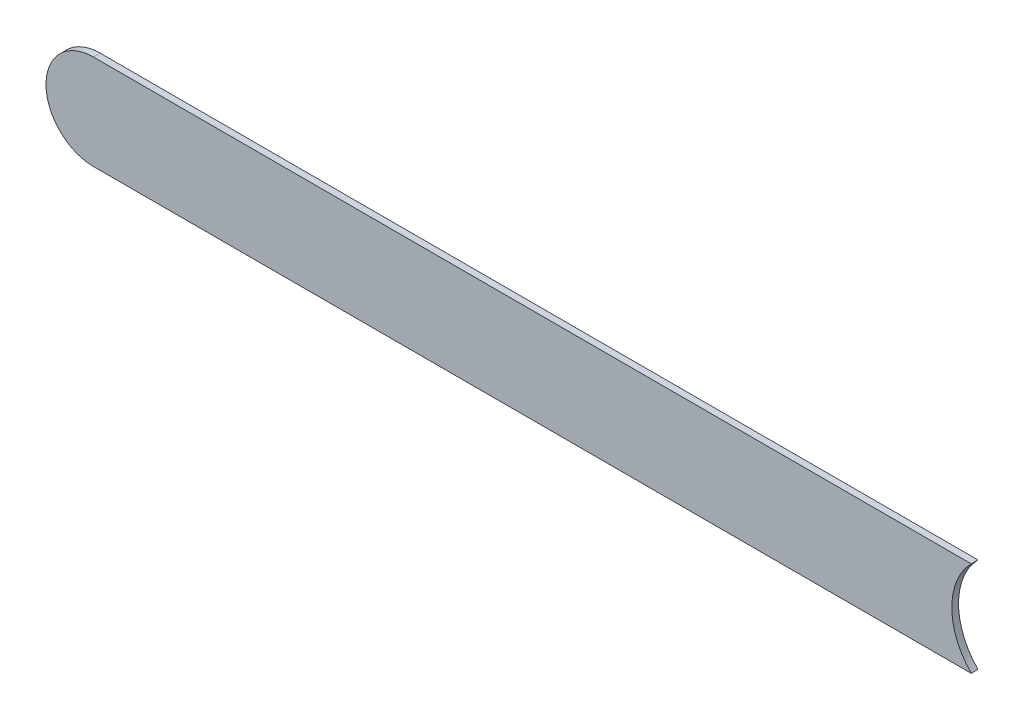
ISO-10303-21;
HEADER;
FILE_DESCRIPTION(('STEP AP214'),'2;1');
FILE_NAME('part.step','',(''),(''),'','','');
FILE_SCHEMA(('AUTOMOTIVE_DESIGN { 1 0 10303 214 1 1 1 1 }'));
ENDSEC;
DATA;
#1=APPLICATION_CONTEXT('core data for automotive mechanical design processes');
#2=APPLICATION_PROTOCOL_DEFINITION('international standard','automotive_design',2000,#1);
#3=PRODUCT_CONTEXT('',#1,'mechanical');
#4=PRODUCT('Part','Part','',(#3));
#5=PRODUCT_RELATED_PRODUCT_CATEGORY('part','',(#4));
#6=PRODUCT_DEFINITION_FORMATION('','',#4);
#7=PRODUCT_DEFINITION_CONTEXT('part definition',#1,'design');
#8=PRODUCT_DEFINITION('design','',#6,#7);
#9=PRODUCT_DEFINITION_SHAPE('','',#8);
#10=(LENGTH_UNIT() NAMED_UNIT(*) SI_UNIT(.MILLI.,.METRE.));
#11=(NAMED_UNIT(*) PLANE_ANGLE_UNIT() SI_UNIT($,.RADIAN.));
#12=(NAMED_UNIT(*) SI_UNIT($,.STERADIAN.) SOLID_ANGLE_UNIT());
#13=UNCERTAINTY_MEASURE_WITH_UNIT(LENGTH_MEASURE(1.E-05),#10,'distance_accuracy_value','');
#14=(GEOMETRIC_REPRESENTATION_CONTEXT(3) GLOBAL_UNCERTAINTY_ASSIGNED_CONTEXT((#13)) GLOBAL_UNIT_ASSIGNED_CONTEXT((#10,
#11,#12)) REPRESENTATION_CONTEXT('',''));
#15=CARTESIAN_POINT('',(0.,0.,0.));
#16=DIRECTION('',(0.,0.,1.));
#17=DIRECTION('',(1.,0.,0.));
#18=AXIS2_PLACEMENT_3D('',#15,#16,#17);
#19=CARTESIAN_POINT('',(52.0189968,105.2500181,0.));
#20=DIRECTION('',(0.,1.,0.));
#21=DIRECTION('',(1.,0.,0.));
#22=AXIS2_PLACEMENT_3D('',#19,#20,#21);
#23=PLANE('',#22);
#24=DIRECTION('',(1.,0.,0.));
#25=VECTOR('',#24,1.);
#26=CARTESIAN_POINT('',(52.0189968,105.2500181,0.03556));
#27=LINE('',#26,#25);
#28=CARTESIAN_POINT('',(52.0189968,105.2500181,0.03556));
#29=VERTEX_POINT('',#28);
#30=CARTESIAN_POINT('',(56.6471266444069,105.2500181,0.03556));
#31=VERTEX_POINT('',#30);
#32=EDGE_CURVE('E11',#29,#31,#27,.T.);
#33=ORIENTED_EDGE('',*,*,#32,.F.);
#34=DIRECTION('',(0.,0.,1.));
#35=VECTOR('',#34,1.);
#36=CARTESIAN_POINT('',(52.0189968,105.2500181,0.));
#37=LINE('',#36,#35);
#38=CARTESIAN_POINT('',(52.0189968,105.2500181,0.));
#39=VERTEX_POINT('',#38);
#40=EDGE_CURVE('E24',#39,#29,#37,.T.);
#41=ORIENTED_EDGE('',*,*,#40,.F.);
#42=DIRECTION('',(1.,0.,0.));
#43=VECTOR('',#42,1.);
#44=CARTESIAN_POINT('',(52.0189968,105.2500181,0.));
#45=LINE('',#44,#43);
#46=CARTESIAN_POINT('',(56.6471266444069,105.2500181,0.));
#47=VERTEX_POINT('',#46);
#48=EDGE_CURVE('E75',#39,#47,#45,.T.);
#49=ORIENTED_EDGE('',*,*,#48,.T.);
#50=DIRECTION('',(0.,0.,1.));
#51=VECTOR('',#50,1.);
#52=CARTESIAN_POINT('',(56.6471266444069,105.2500181,0.));
#53=LINE('',#52,#51);
#54=EDGE_CURVE('E37',#47,#31,#53,.T.);
#55=ORIENTED_EDGE('',*,*,#54,.T.);
#56=EDGE_LOOP('',(#33,#41,#49,#55));
#57=FACE_BOUND('',#56,.T.);
#58=ADVANCED_FACE('F17',(#57),#23,.F.);
#59=CARTESIAN_POINT('',(56.9000132,105.5000176,0.));
#60=DIRECTION('',(0.,0.,-1.));
#61=DIRECTION('',(1.,0.,0.));
#62=AXIS2_PLACEMENT_3D('',#59,#60,#61);
#63=CYLINDRICAL_SURFACE('',#62,0.3556);
#64=DIRECTION('',(0.,0.,1.));
#65=VECTOR('',#64,1.);
#66=CARTESIAN_POINT('',(56.6471266444069,105.7500171,0.));
#67=LINE('',#66,#65);
#68=CARTESIAN_POINT('',(56.6471266444069,105.7500171,0.));
#69=VERTEX_POINT('',#68);
#70=CARTESIAN_POINT('',(56.6471266444069,105.7500171,0.03556));
#71=VERTEX_POINT('',#70);
#72=EDGE_CURVE('E67',#69,#71,#67,.T.);
#73=ORIENTED_EDGE('',*,*,#72,.T.);
#74=CARTESIAN_POINT('',(56.9000132,105.5000176,0.03556));
#75=DIRECTION('',(0.,0.,1.));
#76=DIRECTION('',(1.,0.,0.));
#77=AXIS2_PLACEMENT_3D('',#74,#75,#76);
#78=CIRCLE('',#77,0.3556);
#79=EDGE_CURVE('E82',#71,#31,#78,.T.);
#80=ORIENTED_EDGE('',*,*,#79,.T.);
#81=ORIENTED_EDGE('',*,*,#54,.F.);
#82=CARTESIAN_POINT('',(56.9000132,105.5000176,0.));
#83=DIRECTION('',(0.,0.,1.));
#84=DIRECTION('',(1.,0.,0.));
#85=AXIS2_PLACEMENT_3D('',#82,#83,#84);
#86=CIRCLE('',#85,0.3556);
#87=EDGE_CURVE('E80',#69,#47,#86,.T.);
#88=ORIENTED_EDGE('',*,*,#87,.F.);
#89=EDGE_LOOP('',(#73,#80,#81,#88));
#90=FACE_BOUND('',#89,.T.);
#91=ADVANCED_FACE('F88',(#90),#63,.F.);
#92=CARTESIAN_POINT('',(56.6471266444069,105.7500171,0.));
#93=DIRECTION('',(0.,-1.,0.));
#94=DIRECTION('',(-1.,0.,0.));
#95=AXIS2_PLACEMENT_3D('',#92,#93,#94);
#96=PLANE('',#95);
#97=DIRECTION('',(-1.,0.,0.));
#98=VECTOR('',#97,1.);
#99=CARTESIAN_POINT('',(56.9000132,105.7500171,0.03556));
#100=LINE('',#99,#98);
#101=CARTESIAN_POINT('',(52.0189968,105.7500171,0.03556));
#102=VERTEX_POINT('',#101);
#103=EDGE_CURVE('E71',#71,#102,#100,.T.);
#104=ORIENTED_EDGE('',*,*,#103,.F.);
#105=ORIENTED_EDGE('',*,*,#72,.F.);
#106=DIRECTION('',(-1.,0.,0.));
#107=VECTOR('',#106,1.);
#108=CARTESIAN_POINT('',(56.9000132,105.7500171,0.));
#109=LINE('',#108,#107);
#110=CARTESIAN_POINT('',(52.0189968,105.7500171,0.));
#111=VERTEX_POINT('',#110);
#112=EDGE_CURVE('E63',#69,#111,#109,.T.);
#113=ORIENTED_EDGE('',*,*,#112,.T.);
#114=DIRECTION('',(0.,0.,1.));
#115=VECTOR('',#114,1.);
#116=CARTESIAN_POINT('',(52.0189968,105.7500171,0.));
#117=LINE('',#116,#115);
#118=EDGE_CURVE('E53',#111,#102,#117,.T.);
#119=ORIENTED_EDGE('',*,*,#118,.T.);
#120=EDGE_LOOP('',(#104,#105,#113,#119));
#121=FACE_BOUND('',#120,.T.);
#122=ADVANCED_FACE('F66',(#121),#96,.F.);
#123=CARTESIAN_POINT('',(52.0189968,105.5000176,0.));
#124=DIRECTION('',(0.,0.,-1.));
#125=DIRECTION('',(0.,1.,0.));
#126=AXIS2_PLACEMENT_3D('',#123,#124,#125);
#127=CYLINDRICAL_SURFACE('',#126,0.249999499999992);
#128=CARTESIAN_POINT('',(52.0189968,105.5000176,0.03556));
#129=DIRECTION('',(0.,0.,1.));
#130=DIRECTION('',(0.,1.,0.));
#131=AXIS2_PLACEMENT_3D('',#128,#129,#130);
#132=CIRCLE('',#131,0.249999499999992);
#133=EDGE_CURVE('E59',#102,#29,#132,.T.);
#134=ORIENTED_EDGE('',*,*,#133,.F.);
#135=ORIENTED_EDGE('',*,*,#118,.F.);
#136=CARTESIAN_POINT('',(52.0189968,105.5000176,0.));
#137=DIRECTION('',(0.,0.,1.));
#138=DIRECTION('',(0.,1.,0.));
#139=AXIS2_PLACEMENT_3D('',#136,#137,#138);
#140=CIRCLE('',#139,0.249999499999992);
#141=EDGE_CURVE('E57',#111,#39,#140,.T.);
#142=ORIENTED_EDGE('',*,*,#141,.T.);
#143=ORIENTED_EDGE('',*,*,#40,.T.);
#144=EDGE_LOOP('',(#134,#135,#142,#143));
#145=FACE_BOUND('',#144,.T.);
#146=ADVANCED_FACE('F55',(#145),#127,.T.);
#147=CARTESIAN_POINT('',(52.0189968,105.2500181,0.));
#148=DIRECTION('',(0.,0.,-1.));
#149=DIRECTION('',(-1.,0.,0.));
#150=AXIS2_PLACEMENT_3D('',#147,#148,#149);
#151=PLANE('',#150);
#152=ORIENTED_EDGE('',*,*,#48,.F.);
#153=ORIENTED_EDGE('',*,*,#141,.F.);
#154=ORIENTED_EDGE('',*,*,#112,.F.);
#155=ORIENTED_EDGE('',*,*,#87,.T.);
#156=EDGE_LOOP('',(#152,#153,#154,#155));
#157=FACE_BOUND('',#156,.T.);
#158=ADVANCED_FACE('F74',(#157),#151,.T.);
#159=CARTESIAN_POINT('',(52.0189968,105.2500181,0.03556));
#160=DIRECTION('',(0.,0.,-1.));
#161=DIRECTION('',(-1.,0.,0.));
#162=AXIS2_PLACEMENT_3D('',#159,#160,#161);
#163=PLANE('',#162);
#164=ORIENTED_EDGE('',*,*,#133,.T.);
#165=ORIENTED_EDGE('',*,*,#32,.T.);
#166=ORIENTED_EDGE('',*,*,#79,.F.);
#167=ORIENTED_EDGE('',*,*,#103,.T.);
#168=EDGE_LOOP('',(#164,#165,#166,#167));
#169=FACE_BOUND('',#168,.T.);
#170=ADVANCED_FACE('F91',(#169),#163,.F.);
#171=CLOSED_SHELL('',(#58,#91,#122,#146,#158,#170));
#172=MANIFOLD_SOLID_BREP('B1',#171);
#173=ADVANCED_BREP_SHAPE_REPRESENTATION('',(#18,#172),#14);
#174=SHAPE_DEFINITION_REPRESENTATION(#9,#173);
ENDSEC;
END-ISO-10303-21;
